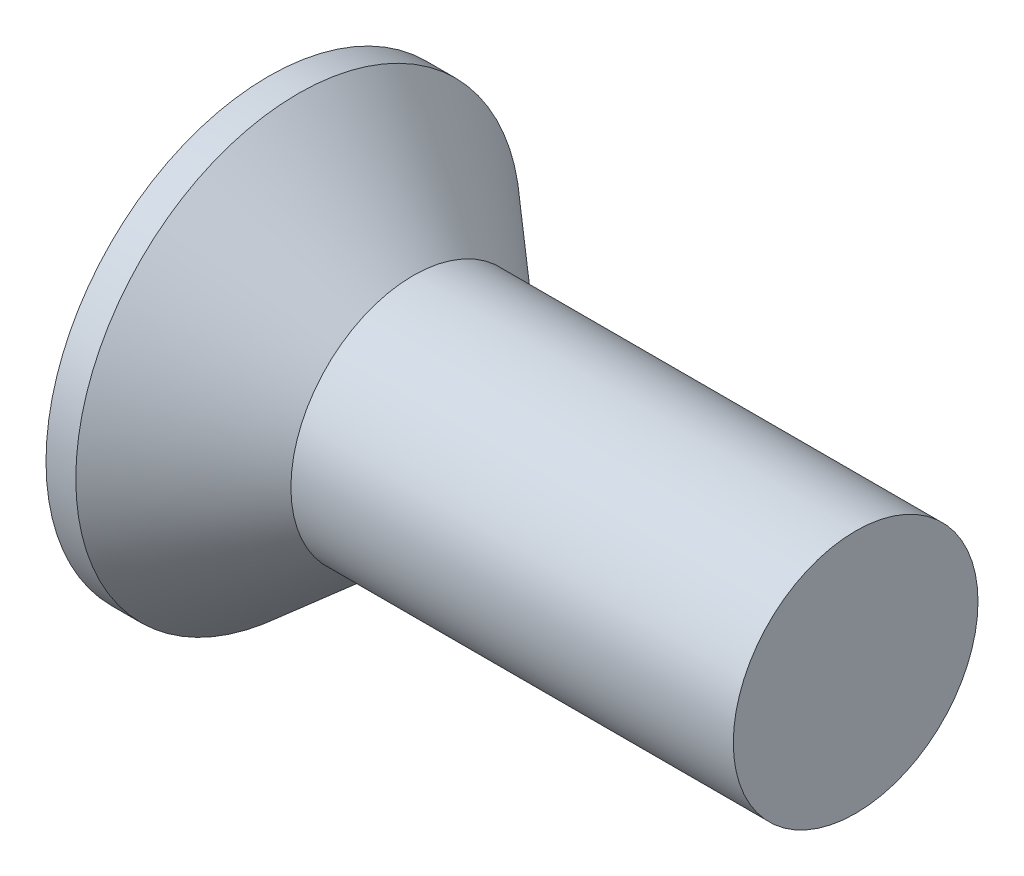
ISO-10303-21;
HEADER;
FILE_DESCRIPTION(('STEP AP214'),'2;1');
FILE_NAME('part.step','',(''),(''),'','','');
FILE_SCHEMA(('AUTOMOTIVE_DESIGN { 1 0 10303 214 1 1 1 1 }'));
ENDSEC;
DATA;
#1=APPLICATION_CONTEXT('core data for automotive mechanical design processes');
#2=APPLICATION_PROTOCOL_DEFINITION('international standard','automotive_design',2000,#1);
#3=PRODUCT_CONTEXT('',#1,'mechanical');
#4=PRODUCT('Part','Part','',(#3));
#5=PRODUCT_RELATED_PRODUCT_CATEGORY('part','',(#4));
#6=PRODUCT_DEFINITION_FORMATION('','',#4);
#7=PRODUCT_DEFINITION_CONTEXT('part definition',#1,'design');
#8=PRODUCT_DEFINITION('design','',#6,#7);
#9=PRODUCT_DEFINITION_SHAPE('','',#8);
#10=(LENGTH_UNIT() NAMED_UNIT(*) SI_UNIT(.MILLI.,.METRE.));
#11=(NAMED_UNIT(*) PLANE_ANGLE_UNIT() SI_UNIT($,.RADIAN.));
#12=(NAMED_UNIT(*) SI_UNIT($,.STERADIAN.) SOLID_ANGLE_UNIT());
#13=UNCERTAINTY_MEASURE_WITH_UNIT(LENGTH_MEASURE(1.E-05),#10,'distance_accuracy_value','');
#14=(GEOMETRIC_REPRESENTATION_CONTEXT(3) GLOBAL_UNCERTAINTY_ASSIGNED_CONTEXT((#13)) GLOBAL_UNIT_ASSIGNED_CONTEXT((#10,
#11,#12)) REPRESENTATION_CONTEXT('',''));
#15=CARTESIAN_POINT('',(0.,0.,0.));
#16=DIRECTION('',(0.,0.,1.));
#17=DIRECTION('',(1.,0.,0.));
#18=AXIS2_PLACEMENT_3D('',#15,#16,#17);
#19=CARTESIAN_POINT('',(0.,0.,0.));
#20=DIRECTION('',(-1.,0.,0.));
#21=DIRECTION('',(0.,0.,1.));
#22=AXIS2_PLACEMENT_3D('',#19,#20,#21);
#23=PLANE('',#22);
#24=CARTESIAN_POINT('',(0.,0.,0.));
#25=DIRECTION('',(-1.,0.,0.));
#26=DIRECTION('',(0.,0.,1.));
#27=AXIS2_PLACEMENT_3D('',#24,#25,#26);
#28=CIRCLE('',#27,7.2136);
#29=CARTESIAN_POINT('',(0.,0.,7.2136));
#30=VERTEX_POINT('',#29);
#31=EDGE_CURVE('E39',#30,#30,#28,.T.);
#32=ORIENTED_EDGE('',*,*,#31,.T.);
#33=EDGE_LOOP('',(#32));
#34=FACE_BOUND('',#33,.T.);
#35=DIRECTION('',(0.,1.,0.));
#36=VECTOR('',#35,1.);
#37=CARTESIAN_POINT('',(0.,-5.6388,-0.939799999999999));
#38=LINE('',#37,#36);
#39=CARTESIAN_POINT('',(0.,-5.6388,-0.939799999999999));
#40=VERTEX_POINT('',#39);
#41=CARTESIAN_POINT('',(0.,-0.939799999999997,-0.9398));
#42=VERTEX_POINT('',#41);
#43=EDGE_CURVE('E100',#40,#42,#38,.T.);
#44=ORIENTED_EDGE('',*,*,#43,.T.);
#45=DIRECTION('',(0.,0.,-1.));
#46=VECTOR('',#45,1.);
#47=CARTESIAN_POINT('',(0.,-0.939800000000019,5.6388));
#48=LINE('',#47,#46);
#49=CARTESIAN_POINT('',(0.,-0.939799999999981,-5.6388));
#50=VERTEX_POINT('',#49);
#51=EDGE_CURVE('E80',#42,#50,#48,.T.);
#52=ORIENTED_EDGE('',*,*,#51,.T.);
#53=DIRECTION('',(0.,1.,0.));
#54=VECTOR('',#53,1.);
#55=CARTESIAN_POINT('',(0.,-0.939799999999981,-5.6388));
#56=LINE('',#55,#54);
#57=CARTESIAN_POINT('',(0.,0.939800000000019,-5.6388));
#58=VERTEX_POINT('',#57);
#59=EDGE_CURVE('E335',#50,#58,#56,.T.);
#60=ORIENTED_EDGE('',*,*,#59,.T.);
#61=DIRECTION('',(0.,0.,1.));
#62=VECTOR('',#61,1.);
#63=CARTESIAN_POINT('',(0.,0.939800000000019,-5.6388));
#64=LINE('',#63,#62);
#65=CARTESIAN_POINT('',(0.,0.939800000000003,-0.939799999999999));
#66=VERTEX_POINT('',#65);
#67=EDGE_CURVE('E96',#58,#66,#64,.T.);
#68=ORIENTED_EDGE('',*,*,#67,.T.);
#69=CARTESIAN_POINT('',(0.,5.6388,-0.939799999999999));
#70=VERTEX_POINT('',#69);
#71=EDGE_CURVE('E90',#66,#70,#38,.T.);
#72=ORIENTED_EDGE('',*,*,#71,.T.);
#73=DIRECTION('',(0.,0.,1.));
#74=VECTOR('',#73,1.);
#75=CARTESIAN_POINT('',(0.,5.6388,-0.939799999999999));
#76=LINE('',#75,#74);
#77=CARTESIAN_POINT('',(0.,5.6388,0.939799999999999));
#78=VERTEX_POINT('',#77);
#79=EDGE_CURVE('E93',#70,#78,#76,.T.);
#80=ORIENTED_EDGE('',*,*,#79,.T.);
#81=DIRECTION('',(0.,-1.,0.));
#82=VECTOR('',#81,1.);
#83=CARTESIAN_POINT('',(0.,5.6388,0.939799999999999));
#84=LINE('',#83,#82);
#85=CARTESIAN_POINT('',(0.,0.939799999999996,0.939799999999999));
#86=VERTEX_POINT('',#85);
#87=EDGE_CURVE('E347',#78,#86,#84,.T.);
#88=ORIENTED_EDGE('',*,*,#87,.T.);
#89=CARTESIAN_POINT('',(0.,0.93979999999998,5.6388));
#90=VERTEX_POINT('',#89);
#91=EDGE_CURVE('E330',#86,#90,#64,.T.);
#92=ORIENTED_EDGE('',*,*,#91,.T.);
#93=DIRECTION('',(0.,-1.,0.));
#94=VECTOR('',#93,1.);
#95=CARTESIAN_POINT('',(0.,0.93979999999998,5.6388));
#96=LINE('',#95,#94);
#97=CARTESIAN_POINT('',(0.,-0.939800000000019,5.6388));
#98=VERTEX_POINT('',#97);
#99=EDGE_CURVE('E316',#90,#98,#96,.T.);
#100=ORIENTED_EDGE('',*,*,#99,.T.);
#101=CARTESIAN_POINT('',(0.,-0.939800000000003,0.9398));
#102=VERTEX_POINT('',#101);
#103=EDGE_CURVE('E328',#98,#102,#48,.T.);
#104=ORIENTED_EDGE('',*,*,#103,.T.);
#105=CARTESIAN_POINT('',(0.,-5.6388,0.939800000000001));
#106=VERTEX_POINT('',#105);
#107=EDGE_CURVE('E106',#102,#106,#84,.T.);
#108=ORIENTED_EDGE('',*,*,#107,.T.);
#109=DIRECTION('',(0.,0.,-1.));
#110=VECTOR('',#109,1.);
#111=CARTESIAN_POINT('',(0.,-5.6388,0.939800000000001));
#112=LINE('',#111,#110);
#113=EDGE_CURVE('E129',#106,#40,#112,.T.);
#114=ORIENTED_EDGE('',*,*,#113,.T.);
#115=EDGE_LOOP('',(#44,#52,#60,#68,#72,#80,#88,#92,#100,#104,#108,#114));
#116=FACE_BOUND('',#115,.T.);
#117=ADVANCED_FACE('F32',(#34,#116),#23,.T.);
#118=CARTESIAN_POINT('',(7.25978181818182,0.,0.427181818181818));
#119=DIRECTION('',(-0.0704353147165806,0.,-0.997516348959142));
#120=DIRECTION('',(-0.997516348959142,0.,0.0704353147165806));
#121=AXIS2_PLACEMENT_3D('',#118,#119,#120);
#122=PLANE('',#121);
#123=ORIENTED_EDGE('',*,*,#107,.F.);
#124=DIRECTION('',(0.995051112036114,0.0702612426437716,-0.0702612426437713));
#125=VECTOR('',#124,1.);
#126=CARTESIAN_POINT('',(7.28964760602848,-0.425072974383487,0.425072974383485));
#127=LINE('',#126,#125);
#128=CARTESIAN_POINT('',(6.6548,-0.469900000000001,0.469899999999998));
#129=VERTEX_POINT('',#128);
#130=EDGE_CURVE('E124',#102,#129,#127,.T.);
#131=ORIENTED_EDGE('',*,*,#130,.T.);
#132=DIRECTION('',(0.788532694609703,0.612467188370514,-0.0556788353064104));
#133=VECTOR('',#132,1.);
#134=CARTESIAN_POINT('',(0.,-5.6388,0.939800000000001));
#135=LINE('',#134,#133);
#136=EDGE_CURVE('E101',#106,#129,#135,.T.);
#137=ORIENTED_EDGE('',*,*,#136,.F.);
#138=EDGE_LOOP('',(#123,#131,#137));
#139=FACE_BOUND('',#138,.T.);
#140=ADVANCED_FACE('F152',(#139),#122,.T.);
#141=DIRECTION('',(0.788532694609703,-0.612467188370514,-0.0556788353064102));
#142=VECTOR('',#141,1.);
#143=CARTESIAN_POINT('',(0.,5.6388,0.939799999999999));
#144=LINE('',#143,#142);
#145=CARTESIAN_POINT('',(6.6548,0.469899999999999,0.4699));
#146=VERTEX_POINT('',#145);
#147=EDGE_CURVE('E46',#78,#146,#144,.T.);
#148=ORIENTED_EDGE('',*,*,#147,.T.);
#149=DIRECTION('',(-0.995051112036114,0.070261242643771,0.0702612426437713));
#150=VECTOR('',#149,1.);
#151=CARTESIAN_POINT('',(7.28964760602848,0.425072974383484,0.425072974383485));
#152=LINE('',#151,#150);
#153=EDGE_CURVE('E343',#146,#86,#152,.T.);
#154=ORIENTED_EDGE('',*,*,#153,.T.);
#155=ORIENTED_EDGE('',*,*,#87,.F.);
#156=EDGE_LOOP('',(#148,#154,#155));
#157=FACE_BOUND('',#156,.T.);
#158=ADVANCED_FACE('F156',(#157),#122,.T.);
#159=CARTESIAN_POINT('',(7.25978181818182,0.,-0.427181818181818));
#160=DIRECTION('',(-0.0704353147165805,0.,0.997516348959142));
#161=DIRECTION('',(0.997516348959142,0.,0.0704353147165805));
#162=AXIS2_PLACEMENT_3D('',#159,#160,#161);
#163=PLANE('',#162);
#164=DIRECTION('',(0.788532694609703,0.612467188370514,0.0556788353064102));
#165=VECTOR('',#164,1.);
#166=CARTESIAN_POINT('',(0.,-5.6388,-0.939799999999999));
#167=LINE('',#166,#165);
#168=CARTESIAN_POINT('',(6.6548,-0.469899999999998,-0.469900000000001));
#169=VERTEX_POINT('',#168);
#170=EDGE_CURVE('E55',#40,#169,#167,.T.);
#171=ORIENTED_EDGE('',*,*,#170,.T.);
#172=DIRECTION('',(-0.995051112036114,-0.0702612426437711,-0.0702612426437713));
#173=VECTOR('',#172,1.);
#174=CARTESIAN_POINT('',(7.28964760602848,-0.425072974383484,-0.425072974383486));
#175=LINE('',#174,#173);
#176=EDGE_CURVE('E11',#169,#42,#175,.T.);
#177=ORIENTED_EDGE('',*,*,#176,.T.);
#178=ORIENTED_EDGE('',*,*,#43,.F.);
#179=EDGE_LOOP('',(#171,#177,#178));
#180=FACE_BOUND('',#179,.T.);
#181=ADVANCED_FACE('F149',(#180),#163,.T.);
#182=ORIENTED_EDGE('',*,*,#71,.F.);
#183=DIRECTION('',(0.995051112036114,-0.0702612426437715,0.0702612426437713));
#184=VECTOR('',#183,1.);
#185=CARTESIAN_POINT('',(7.28964760602848,0.425072974383487,-0.425072974383485));
#186=LINE('',#185,#184);
#187=CARTESIAN_POINT('',(6.6548,0.4699,-0.4699));
#188=VERTEX_POINT('',#187);
#189=EDGE_CURVE('E109',#66,#188,#186,.T.);
#190=ORIENTED_EDGE('',*,*,#189,.T.);
#191=DIRECTION('',(0.788532694609703,-0.612467188370514,0.0556788353064102));
#192=VECTOR('',#191,1.);
#193=CARTESIAN_POINT('',(0.,5.6388,-0.939799999999999));
#194=LINE('',#193,#192);
#195=EDGE_CURVE('E105',#70,#188,#194,.T.);
#196=ORIENTED_EDGE('',*,*,#195,.F.);
#197=EDGE_LOOP('',(#182,#190,#196));
#198=FACE_BOUND('',#197,.T.);
#199=ADVANCED_FACE('F108',(#198),#163,.T.);
#200=CARTESIAN_POINT('',(-6.34999999999999,0.,0.));
#201=DIRECTION('',(-1.,0.,0.));
#202=DIRECTION('',(0.,0.,1.));
#203=AXIS2_PLACEMENT_3D('',#200,#201,#202);
#204=CYLINDRICAL_SURFACE('',#203,7.2136);
#205=CARTESIAN_POINT('',(0.966227073828923,0.,0.));
#206=DIRECTION('',(-1.,0.,0.));
#207=DIRECTION('',(0.,0.,1.));
#208=AXIS2_PLACEMENT_3D('',#205,#206,#207);
#209=CIRCLE('',#208,7.2136);
#210=CARTESIAN_POINT('',(0.966227073828923,0.,7.2136));
#211=VERTEX_POINT('',#210);
#212=EDGE_CURVE('E132',#211,#211,#209,.T.);
#213=ORIENTED_EDGE('',*,*,#212,.T.);
#214=EDGE_LOOP('',(#213));
#215=FACE_BOUND('',#214,.T.);
#216=ORIENTED_EDGE('',*,*,#31,.F.);
#217=EDGE_LOOP('',(#216));
#218=FACE_BOUND('',#217,.T.);
#219=ADVANCED_FACE('F138',(#215,#218),#204,.T.);
#220=CARTESIAN_POINT('',(0.966227073828923,0.,0.));
#221=DIRECTION('',(-1.,0.,0.));
#222=DIRECTION('',(0.,0.,1.));
#223=AXIS2_PLACEMENT_3D('',#220,#221,#222);
#224=CONICAL_SURFACE('',#223,7.2136,0.715584993317677);
#225=CARTESIAN_POINT('',(4.699,0.,0.));
#226=DIRECTION('',(-1.,0.,0.));
#227=DIRECTION('',(0.,0.,1.));
#228=AXIS2_PLACEMENT_3D('',#225,#226,#227);
#229=CIRCLE('',#228,3.96875);
#230=CARTESIAN_POINT('',(4.699,0.,3.96875));
#231=VERTEX_POINT('',#230);
#232=EDGE_CURVE('E128',#231,#231,#229,.T.);
#233=ORIENTED_EDGE('',*,*,#232,.T.);
#234=EDGE_LOOP('',(#233));
#235=FACE_BOUND('',#234,.T.);
#236=ORIENTED_EDGE('',*,*,#212,.F.);
#237=EDGE_LOOP('',(#236));
#238=FACE_BOUND('',#237,.T.);
#239=ADVANCED_FACE('F140',(#235,#238),#224,.T.);
#240=CARTESIAN_POINT('',(-6.34999999999999,0.,0.));
#241=DIRECTION('',(-1.,0.,0.));
#242=DIRECTION('',(0.,0.,1.));
#243=AXIS2_PLACEMENT_3D('',#240,#241,#242);
#244=CYLINDRICAL_SURFACE('',#243,3.96875);
#245=CARTESIAN_POINT('',(19.05,0.,0.));
#246=DIRECTION('',(-1.,0.,0.));
#247=DIRECTION('',(0.,0.,1.));
#248=AXIS2_PLACEMENT_3D('',#245,#246,#247);
#249=CIRCLE('',#248,3.96875);
#250=CARTESIAN_POINT('',(19.05,0.,3.96875));
#251=VERTEX_POINT('',#250);
#252=EDGE_CURVE('E125',#251,#251,#249,.T.);
#253=ORIENTED_EDGE('',*,*,#252,.T.);
#254=EDGE_LOOP('',(#253));
#255=FACE_BOUND('',#254,.T.);
#256=ORIENTED_EDGE('',*,*,#232,.F.);
#257=EDGE_LOOP('',(#256));
#258=FACE_BOUND('',#257,.T.);
#259=ADVANCED_FACE('F146',(#255,#258),#244,.T.);
#260=CARTESIAN_POINT('',(19.05,3.96875,0.));
#261=DIRECTION('',(1.,0.,0.));
#262=DIRECTION('',(0.,0.,-1.));
#263=AXIS2_PLACEMENT_3D('',#260,#261,#262);
#264=PLANE('',#263);
#265=ORIENTED_EDGE('',*,*,#252,.F.);
#266=EDGE_LOOP('',(#265));
#267=FACE_BOUND('',#266,.T.);
#268=ADVANCED_FACE('F176',(#267),#264,.T.);
#269=CARTESIAN_POINT('',(6.6548,0.4699,-0.4699));
#270=DIRECTION('',(1.,0.,0.));
#271=DIRECTION('',(0.,0.,-1.));
#272=AXIS2_PLACEMENT_3D('',#269,#270,#271);
#273=PLANE('',#272);
#274=DIRECTION('',(0.,1.,0.));
#275=VECTOR('',#274,1.);
#276=CARTESIAN_POINT('',(6.6548,-0.4699,-0.4699));
#277=LINE('',#276,#275);
#278=EDGE_CURVE('E120',#169,#188,#277,.T.);
#279=ORIENTED_EDGE('',*,*,#278,.F.);
#280=DIRECTION('',(0.,0.,-1.));
#281=VECTOR('',#280,1.);
#282=CARTESIAN_POINT('',(6.6548,-0.4699,0.4699));
#283=LINE('',#282,#281);
#284=EDGE_CURVE('E111',#129,#169,#283,.T.);
#285=ORIENTED_EDGE('',*,*,#284,.F.);
#286=DIRECTION('',(0.,-1.,0.));
#287=VECTOR('',#286,1.);
#288=CARTESIAN_POINT('',(6.6548,0.4699,0.4699));
#289=LINE('',#288,#287);
#290=EDGE_CURVE('E114',#146,#129,#289,.T.);
#291=ORIENTED_EDGE('',*,*,#290,.F.);
#292=DIRECTION('',(0.,0.,1.));
#293=VECTOR('',#292,1.);
#294=CARTESIAN_POINT('',(6.6548,0.4699,-0.4699));
#295=LINE('',#294,#293);
#296=EDGE_CURVE('E118',#188,#146,#295,.T.);
#297=ORIENTED_EDGE('',*,*,#296,.F.);
#298=EDGE_LOOP('',(#279,#285,#291,#297));
#299=FACE_BOUND('',#298,.T.);
#300=ADVANCED_FACE('F173',(#299),#273,.F.);
#301=CARTESIAN_POINT('',(6.6548,-0.4699,-0.4699));
#302=DIRECTION('',(-0.613418766235738,0.789757821885814,0.));
#303=DIRECTION('',(-0.789757821885814,-0.613418766235738,0.));
#304=AXIS2_PLACEMENT_3D('',#301,#302,#303);
#305=PLANE('',#304);
#306=ORIENTED_EDGE('',*,*,#170,.F.);
#307=ORIENTED_EDGE('',*,*,#113,.F.);
#308=ORIENTED_EDGE('',*,*,#136,.T.);
#309=ORIENTED_EDGE('',*,*,#284,.T.);
#310=EDGE_LOOP('',(#306,#307,#308,#309));
#311=FACE_BOUND('',#310,.T.);
#312=ADVANCED_FACE('F165',(#311),#305,.T.);
#313=CARTESIAN_POINT('',(0.,5.6388,0.939799999999999));
#314=DIRECTION('',(-0.613418766235738,-0.789757821885814,0.));
#315=DIRECTION('',(0.789757821885814,-0.613418766235738,0.));
#316=AXIS2_PLACEMENT_3D('',#313,#314,#315);
#317=PLANE('',#316);
#318=ORIENTED_EDGE('',*,*,#147,.F.);
#319=ORIENTED_EDGE('',*,*,#79,.F.);
#320=ORIENTED_EDGE('',*,*,#195,.T.);
#321=ORIENTED_EDGE('',*,*,#296,.T.);
#322=EDGE_LOOP('',(#318,#319,#320,#321));
#323=FACE_BOUND('',#322,.T.);
#324=ADVANCED_FACE('F104',(#323),#317,.T.);
#325=CARTESIAN_POINT('',(7.25978181818182,-0.427181818181818,0.));
#326=DIRECTION('',(-0.0704353147165806,0.997516348959142,0.));
#327=DIRECTION('',(-0.997516348959142,-0.0704353147165806,0.));
#328=AXIS2_PLACEMENT_3D('',#325,#326,#327);
#329=PLANE('',#328);
#330=DIRECTION('',(0.788532694609703,0.0556788353064083,0.612467188370514));
#331=VECTOR('',#330,1.);
#332=CARTESIAN_POINT('',(0.,-0.939799999999981,-5.6388));
#333=LINE('',#332,#331);
#334=EDGE_CURVE('E337',#50,#169,#333,.T.);
#335=ORIENTED_EDGE('',*,*,#334,.F.);
#336=ORIENTED_EDGE('',*,*,#51,.F.);
#337=ORIENTED_EDGE('',*,*,#176,.F.);
#338=EDGE_LOOP('',(#335,#336,#337));
#339=FACE_BOUND('',#338,.T.);
#340=ADVANCED_FACE('F172',(#339),#329,.T.);
#341=CARTESIAN_POINT('',(7.25978181818182,0.427181818181818,0.));
#342=DIRECTION('',(-0.0704353147165805,-0.997516348959142,0.));
#343=DIRECTION('',(0.997516348959142,-0.0704353147165805,0.));
#344=AXIS2_PLACEMENT_3D('',#341,#342,#343);
#345=PLANE('',#344);
#346=ORIENTED_EDGE('',*,*,#67,.F.);
#347=DIRECTION('',(0.788532694609703,-0.0556788353064124,0.612467188370514));
#348=VECTOR('',#347,1.);
#349=CARTESIAN_POINT('',(0.,0.939800000000019,-5.6388));
#350=LINE('',#349,#348);
#351=EDGE_CURVE('E71',#58,#188,#350,.T.);
#352=ORIENTED_EDGE('',*,*,#351,.T.);
#353=ORIENTED_EDGE('',*,*,#189,.F.);
#354=EDGE_LOOP('',(#346,#352,#353));
#355=FACE_BOUND('',#354,.T.);
#356=ADVANCED_FACE('F216',(#355),#345,.T.);
#357=CARTESIAN_POINT('',(6.6548,0.469900000000002,-0.469899999999998));
#358=DIRECTION('',(-0.613418766235738,0.,0.789757821885814));
#359=DIRECTION('',(-0.789757821885814,0.,-0.613418766235738));
#360=AXIS2_PLACEMENT_3D('',#357,#358,#359);
#361=PLANE('',#360);
#362=ORIENTED_EDGE('',*,*,#351,.F.);
#363=ORIENTED_EDGE('',*,*,#59,.F.);
#364=ORIENTED_EDGE('',*,*,#334,.T.);
#365=ORIENTED_EDGE('',*,*,#278,.T.);
#366=EDGE_LOOP('',(#362,#363,#364,#365));
#367=FACE_BOUND('',#366,.T.);
#368=ADVANCED_FACE('F224',(#367),#361,.T.);
#369=ORIENTED_EDGE('',*,*,#103,.F.);
#370=DIRECTION('',(0.788532694609703,0.0556788353064124,-0.612467188370514));
#371=VECTOR('',#370,1.);
#372=CARTESIAN_POINT('',(0.,-0.939800000000019,5.6388));
#373=LINE('',#372,#371);
#374=EDGE_CURVE('E313',#98,#129,#373,.T.);
#375=ORIENTED_EDGE('',*,*,#374,.T.);
#376=ORIENTED_EDGE('',*,*,#130,.F.);
#377=EDGE_LOOP('',(#369,#375,#376));
#378=FACE_BOUND('',#377,.T.);
#379=ADVANCED_FACE('F218',(#378),#329,.T.);
#380=DIRECTION('',(0.788532694609703,-0.0556788353064081,-0.612467188370514));
#381=VECTOR('',#380,1.);
#382=CARTESIAN_POINT('',(0.,0.93979999999998,5.6388));
#383=LINE('',#382,#381);
#384=EDGE_CURVE('E324',#90,#146,#383,.T.);
#385=ORIENTED_EDGE('',*,*,#384,.F.);
#386=ORIENTED_EDGE('',*,*,#91,.F.);
#387=ORIENTED_EDGE('',*,*,#153,.F.);
#388=EDGE_LOOP('',(#385,#386,#387));
#389=FACE_BOUND('',#388,.T.);
#390=ADVANCED_FACE('F226',(#389),#345,.T.);
#391=CARTESIAN_POINT('',(0.,-0.939800000000019,5.6388));
#392=DIRECTION('',(-0.613418766235738,0.,-0.789757821885814));
#393=DIRECTION('',(0.789757821885814,0.,-0.613418766235738));
#394=AXIS2_PLACEMENT_3D('',#391,#392,#393);
#395=PLANE('',#394);
#396=ORIENTED_EDGE('',*,*,#374,.F.);
#397=ORIENTED_EDGE('',*,*,#99,.F.);
#398=ORIENTED_EDGE('',*,*,#384,.T.);
#399=ORIENTED_EDGE('',*,*,#290,.T.);
#400=EDGE_LOOP('',(#396,#397,#398,#399));
#401=FACE_BOUND('',#400,.T.);
#402=ADVANCED_FACE('F245',(#401),#395,.T.);
#403=CLOSED_SHELL('',(#117,#140,#158,#181,#199,#219,#239,#259,#268,#300,#312,#324,#340,#356,
#368,#379,#390,#402));
#404=MANIFOLD_SOLID_BREP('B2',#403);
#405=ADVANCED_BREP_SHAPE_REPRESENTATION('',(#18,#404),#14);
#406=SHAPE_DEFINITION_REPRESENTATION(#9,#405);
ENDSEC;
END-ISO-10303-21;
